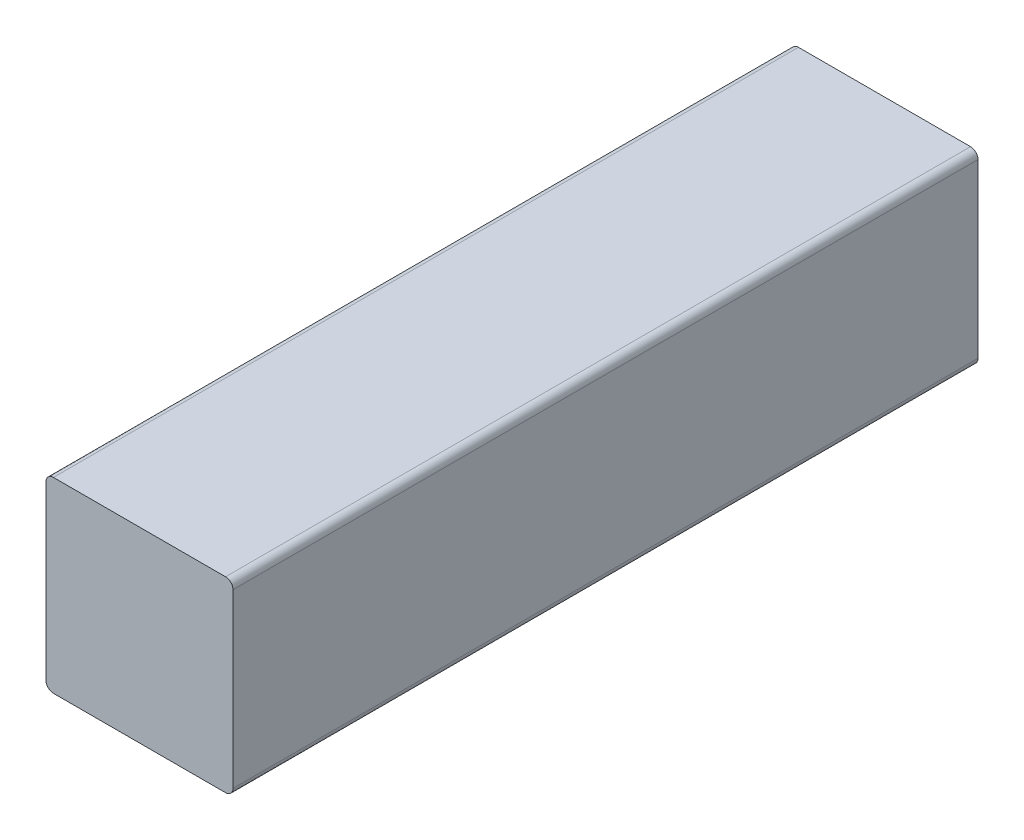
ISO-10303-21;
HEADER;
FILE_DESCRIPTION(('STEP AP214'),'2;1');
FILE_NAME('part.step','',(''),(''),'','','');
FILE_SCHEMA(('AUTOMOTIVE_DESIGN { 1 0 10303 214 1 1 1 1 }'));
ENDSEC;
DATA;
#1=APPLICATION_CONTEXT('core data for automotive mechanical design processes');
#2=APPLICATION_PROTOCOL_DEFINITION('international standard','automotive_design',2000,#1);
#3=PRODUCT_CONTEXT('',#1,'mechanical');
#4=PRODUCT('Part','Part','',(#3));
#5=PRODUCT_RELATED_PRODUCT_CATEGORY('part','',(#4));
#6=PRODUCT_DEFINITION_FORMATION('','',#4);
#7=PRODUCT_DEFINITION_CONTEXT('part definition',#1,'design');
#8=PRODUCT_DEFINITION('design','',#6,#7);
#9=PRODUCT_DEFINITION_SHAPE('','',#8);
#10=(LENGTH_UNIT() NAMED_UNIT(*) SI_UNIT(.MILLI.,.METRE.));
#11=(NAMED_UNIT(*) PLANE_ANGLE_UNIT() SI_UNIT($,.RADIAN.));
#12=(NAMED_UNIT(*) SI_UNIT($,.STERADIAN.) SOLID_ANGLE_UNIT());
#13=UNCERTAINTY_MEASURE_WITH_UNIT(LENGTH_MEASURE(1.E-05),#10,'distance_accuracy_value','');
#14=(GEOMETRIC_REPRESENTATION_CONTEXT(3) GLOBAL_UNCERTAINTY_ASSIGNED_CONTEXT((#13)) GLOBAL_UNIT_ASSIGNED_CONTEXT((#10,
#11,#12)) REPRESENTATION_CONTEXT('',''));
#15=CARTESIAN_POINT('',(0.,0.,0.));
#16=DIRECTION('',(0.,0.,1.));
#17=DIRECTION('',(1.,0.,0.));
#18=AXIS2_PLACEMENT_3D('',#15,#16,#17);
#19=CARTESIAN_POINT('',(0.254,6.1214,25.4));
#20=DIRECTION('',(0.,0.,-1.));
#21=DIRECTION('',(-1.,0.,0.));
#22=AXIS2_PLACEMENT_3D('',#19,#20,#21);
#23=CYLINDRICAL_SURFACE('',#22,0.254);
#24=CARTESIAN_POINT('',(0.254,6.1214,0.));
#25=DIRECTION('',(0.,0.,1.));
#26=DIRECTION('',(1.,0.,0.));
#27=AXIS2_PLACEMENT_3D('',#24,#25,#26);
#28=CIRCLE('',#27,0.254);
#29=CARTESIAN_POINT('',(0.254000000000002,6.3754,0.));
#30=VERTEX_POINT('',#29);
#31=CARTESIAN_POINT('',(0.,6.1214,0.));
#32=VERTEX_POINT('',#31);
#33=EDGE_CURVE('E129',#30,#32,#28,.T.);
#34=ORIENTED_EDGE('',*,*,#33,.T.);
#35=DIRECTION('',(0.,0.,-1.));
#36=VECTOR('',#35,1.);
#37=CARTESIAN_POINT('',(0.,6.1214,25.4));
#38=LINE('',#37,#36);
#39=CARTESIAN_POINT('',(0.,6.1214,25.4));
#40=VERTEX_POINT('',#39);
#41=EDGE_CURVE('E11',#40,#32,#38,.T.);
#42=ORIENTED_EDGE('',*,*,#41,.F.);
#43=CARTESIAN_POINT('',(0.254,6.1214,25.4));
#44=DIRECTION('',(0.,0.,1.));
#45=DIRECTION('',(1.,0.,0.));
#46=AXIS2_PLACEMENT_3D('',#43,#44,#45);
#47=CIRCLE('',#46,0.254);
#48=CARTESIAN_POINT('',(0.254000000000002,6.3754,25.4));
#49=VERTEX_POINT('',#48);
#50=EDGE_CURVE('E143',#49,#40,#47,.T.);
#51=ORIENTED_EDGE('',*,*,#50,.F.);
#52=DIRECTION('',(0.,0.,-1.));
#53=VECTOR('',#52,1.);
#54=CARTESIAN_POINT('',(0.254000000000002,6.3754,25.4));
#55=LINE('',#54,#53);
#56=EDGE_CURVE('E125',#49,#30,#55,.T.);
#57=ORIENTED_EDGE('',*,*,#56,.T.);
#58=EDGE_LOOP('',(#34,#42,#51,#57));
#59=FACE_BOUND('',#58,.T.);
#60=ADVANCED_FACE('F33',(#59),#23,.T.);
#61=CARTESIAN_POINT('',(0.,6.1214,25.4));
#62=DIRECTION('',(1.,0.,0.));
#63=DIRECTION('',(0.,0.,-1.));
#64=AXIS2_PLACEMENT_3D('',#61,#62,#63);
#65=PLANE('',#64);
#66=DIRECTION('',(0.,-1.,0.));
#67=VECTOR('',#66,1.);
#68=CARTESIAN_POINT('',(0.,6.1214,0.));
#69=LINE('',#68,#67);
#70=CARTESIAN_POINT('',(0.,0.254000000000002,0.));
#71=VERTEX_POINT('',#70);
#72=EDGE_CURVE('E132',#32,#71,#69,.T.);
#73=ORIENTED_EDGE('',*,*,#72,.T.);
#74=DIRECTION('',(0.,0.,-1.));
#75=VECTOR('',#74,1.);
#76=CARTESIAN_POINT('',(0.,0.254000000000002,25.4));
#77=LINE('',#76,#75);
#78=CARTESIAN_POINT('',(0.,0.254000000000002,25.4));
#79=VERTEX_POINT('',#78);
#80=EDGE_CURVE('E41',#79,#71,#77,.T.);
#81=ORIENTED_EDGE('',*,*,#80,.F.);
#82=DIRECTION('',(0.,-1.,0.));
#83=VECTOR('',#82,1.);
#84=CARTESIAN_POINT('',(0.,6.1214,25.4));
#85=LINE('',#84,#83);
#86=EDGE_CURVE('E92',#40,#79,#85,.T.);
#87=ORIENTED_EDGE('',*,*,#86,.F.);
#88=ORIENTED_EDGE('',*,*,#41,.T.);
#89=EDGE_LOOP('',(#73,#81,#87,#88));
#90=FACE_BOUND('',#89,.T.);
#91=ADVANCED_FACE('F178',(#90),#65,.F.);
#92=CARTESIAN_POINT('',(0.254,0.254,25.4));
#93=DIRECTION('',(0.,0.,-1.));
#94=DIRECTION('',(-1.,0.,0.));
#95=AXIS2_PLACEMENT_3D('',#92,#93,#94);
#96=CYLINDRICAL_SURFACE('',#95,0.254);
#97=CARTESIAN_POINT('',(0.254,0.254,0.));
#98=DIRECTION('',(0.,0.,1.));
#99=DIRECTION('',(1.,0.,0.));
#100=AXIS2_PLACEMENT_3D('',#97,#98,#99);
#101=CIRCLE('',#100,0.254);
#102=CARTESIAN_POINT('',(0.254000000000002,0.,0.));
#103=VERTEX_POINT('',#102);
#104=EDGE_CURVE('E134',#71,#103,#101,.T.);
#105=ORIENTED_EDGE('',*,*,#104,.T.);
#106=DIRECTION('',(0.,0.,-1.));
#107=VECTOR('',#106,1.);
#108=CARTESIAN_POINT('',(0.254000000000002,0.,25.4));
#109=LINE('',#108,#107);
#110=CARTESIAN_POINT('',(0.254000000000002,0.,25.4));
#111=VERTEX_POINT('',#110);
#112=EDGE_CURVE('E150',#111,#103,#109,.T.);
#113=ORIENTED_EDGE('',*,*,#112,.F.);
#114=CARTESIAN_POINT('',(0.254,0.254,25.4));
#115=DIRECTION('',(0.,0.,1.));
#116=DIRECTION('',(1.,0.,0.));
#117=AXIS2_PLACEMENT_3D('',#114,#115,#116);
#118=CIRCLE('',#117,0.254);
#119=EDGE_CURVE('E158',#79,#111,#118,.T.);
#120=ORIENTED_EDGE('',*,*,#119,.F.);
#121=ORIENTED_EDGE('',*,*,#80,.T.);
#122=EDGE_LOOP('',(#105,#113,#120,#121));
#123=FACE_BOUND('',#122,.T.);
#124=ADVANCED_FACE('F156',(#123),#96,.T.);
#125=CARTESIAN_POINT('',(0.254000000000002,0.,25.4));
#126=DIRECTION('',(0.,1.,0.));
#127=DIRECTION('',(0.,0.,1.));
#128=AXIS2_PLACEMENT_3D('',#125,#126,#127);
#129=PLANE('',#128);
#130=DIRECTION('',(1.,0.,0.));
#131=VECTOR('',#130,1.);
#132=CARTESIAN_POINT('',(0.254000000000002,0.,0.));
#133=LINE('',#132,#131);
#134=CARTESIAN_POINT('',(6.1214,0.,0.));
#135=VERTEX_POINT('',#134);
#136=EDGE_CURVE('E136',#103,#135,#133,.T.);
#137=ORIENTED_EDGE('',*,*,#136,.T.);
#138=DIRECTION('',(0.,0.,-1.));
#139=VECTOR('',#138,1.);
#140=CARTESIAN_POINT('',(6.1214,0.,25.4));
#141=LINE('',#140,#139);
#142=CARTESIAN_POINT('',(6.1214,0.,25.4));
#143=VERTEX_POINT('',#142);
#144=EDGE_CURVE('E147',#143,#135,#141,.T.);
#145=ORIENTED_EDGE('',*,*,#144,.F.);
#146=DIRECTION('',(1.,0.,0.));
#147=VECTOR('',#146,1.);
#148=CARTESIAN_POINT('',(0.254000000000002,0.,25.4));
#149=LINE('',#148,#147);
#150=EDGE_CURVE('E170',#111,#143,#149,.T.);
#151=ORIENTED_EDGE('',*,*,#150,.F.);
#152=ORIENTED_EDGE('',*,*,#112,.T.);
#153=EDGE_LOOP('',(#137,#145,#151,#152));
#154=FACE_BOUND('',#153,.T.);
#155=ADVANCED_FACE('F166',(#154),#129,.F.);
#156=CARTESIAN_POINT('',(6.1214,0.254,25.4));
#157=DIRECTION('',(0.,0.,-1.));
#158=DIRECTION('',(-1.,0.,0.));
#159=AXIS2_PLACEMENT_3D('',#156,#157,#158);
#160=CYLINDRICAL_SURFACE('',#159,0.254);
#161=CARTESIAN_POINT('',(6.1214,0.254,0.));
#162=DIRECTION('',(0.,0.,1.));
#163=DIRECTION('',(1.,0.,0.));
#164=AXIS2_PLACEMENT_3D('',#161,#162,#163);
#165=CIRCLE('',#164,0.254);
#166=CARTESIAN_POINT('',(6.3754,0.254000000000002,0.));
#167=VERTEX_POINT('',#166);
#168=EDGE_CURVE('E138',#135,#167,#165,.T.);
#169=ORIENTED_EDGE('',*,*,#168,.T.);
#170=DIRECTION('',(0.,0.,-1.));
#171=VECTOR('',#170,1.);
#172=CARTESIAN_POINT('',(6.3754,0.254000000000002,25.4));
#173=LINE('',#172,#171);
#174=CARTESIAN_POINT('',(6.3754,0.254000000000002,25.4));
#175=VERTEX_POINT('',#174);
#176=EDGE_CURVE('E120',#175,#167,#173,.T.);
#177=ORIENTED_EDGE('',*,*,#176,.F.);
#178=CARTESIAN_POINT('',(6.1214,0.254,25.4));
#179=DIRECTION('',(0.,0.,1.));
#180=DIRECTION('',(1.,0.,0.));
#181=AXIS2_PLACEMENT_3D('',#178,#179,#180);
#182=CIRCLE('',#181,0.254);
#183=EDGE_CURVE('E111',#143,#175,#182,.T.);
#184=ORIENTED_EDGE('',*,*,#183,.F.);
#185=ORIENTED_EDGE('',*,*,#144,.T.);
#186=EDGE_LOOP('',(#169,#177,#184,#185));
#187=FACE_BOUND('',#186,.T.);
#188=ADVANCED_FACE('F169',(#187),#160,.T.);
#189=CARTESIAN_POINT('',(6.3754,0.254000000000002,25.4));
#190=DIRECTION('',(-1.,0.,0.));
#191=DIRECTION('',(0.,0.,1.));
#192=AXIS2_PLACEMENT_3D('',#189,#190,#191);
#193=PLANE('',#192);
#194=DIRECTION('',(0.,1.,0.));
#195=VECTOR('',#194,1.);
#196=CARTESIAN_POINT('',(6.3754,0.254000000000002,0.));
#197=LINE('',#196,#195);
#198=CARTESIAN_POINT('',(6.3754,6.1214,0.));
#199=VERTEX_POINT('',#198);
#200=EDGE_CURVE('E119',#167,#199,#197,.T.);
#201=ORIENTED_EDGE('',*,*,#200,.T.);
#202=DIRECTION('',(0.,0.,-1.));
#203=VECTOR('',#202,1.);
#204=CARTESIAN_POINT('',(6.3754,6.1214,25.4));
#205=LINE('',#204,#203);
#206=CARTESIAN_POINT('',(6.3754,6.1214,25.4));
#207=VERTEX_POINT('',#206);
#208=EDGE_CURVE('E116',#207,#199,#205,.T.);
#209=ORIENTED_EDGE('',*,*,#208,.F.);
#210=DIRECTION('',(0.,1.,0.));
#211=VECTOR('',#210,1.);
#212=CARTESIAN_POINT('',(6.3754,0.254000000000002,25.4));
#213=LINE('',#212,#211);
#214=EDGE_CURVE('E105',#175,#207,#213,.T.);
#215=ORIENTED_EDGE('',*,*,#214,.F.);
#216=ORIENTED_EDGE('',*,*,#176,.T.);
#217=EDGE_LOOP('',(#201,#209,#215,#216));
#218=FACE_BOUND('',#217,.T.);
#219=ADVANCED_FACE('F117',(#218),#193,.F.);
#220=CARTESIAN_POINT('',(6.1214,6.1214,25.4));
#221=DIRECTION('',(0.,0.,-1.));
#222=DIRECTION('',(-1.,0.,0.));
#223=AXIS2_PLACEMENT_3D('',#220,#221,#222);
#224=CYLINDRICAL_SURFACE('',#223,0.254);
#225=CARTESIAN_POINT('',(6.1214,6.1214,0.));
#226=DIRECTION('',(0.,0.,1.));
#227=DIRECTION('',(1.,0.,0.));
#228=AXIS2_PLACEMENT_3D('',#225,#226,#227);
#229=CIRCLE('',#228,0.254);
#230=CARTESIAN_POINT('',(6.1214,6.3754,0.));
#231=VERTEX_POINT('',#230);
#232=EDGE_CURVE('E78',#199,#231,#229,.T.);
#233=ORIENTED_EDGE('',*,*,#232,.T.);
#234=DIRECTION('',(0.,0.,-1.));
#235=VECTOR('',#234,1.);
#236=CARTESIAN_POINT('',(6.1214,6.3754,25.4));
#237=LINE('',#236,#235);
#238=CARTESIAN_POINT('',(6.1214,6.3754,25.4));
#239=VERTEX_POINT('',#238);
#240=EDGE_CURVE('E121',#239,#231,#237,.T.);
#241=ORIENTED_EDGE('',*,*,#240,.F.);
#242=CARTESIAN_POINT('',(6.1214,6.1214,25.4));
#243=DIRECTION('',(0.,0.,1.));
#244=DIRECTION('',(1.,0.,0.));
#245=AXIS2_PLACEMENT_3D('',#242,#243,#244);
#246=CIRCLE('',#245,0.254);
#247=EDGE_CURVE('E109',#207,#239,#246,.T.);
#248=ORIENTED_EDGE('',*,*,#247,.F.);
#249=ORIENTED_EDGE('',*,*,#208,.T.);
#250=EDGE_LOOP('',(#233,#241,#248,#249));
#251=FACE_BOUND('',#250,.T.);
#252=ADVANCED_FACE('F123',(#251),#224,.T.);
#253=CARTESIAN_POINT('',(6.1214,6.3754,25.4));
#254=DIRECTION('',(0.,-1.,0.));
#255=DIRECTION('',(0.,0.,-1.));
#256=AXIS2_PLACEMENT_3D('',#253,#254,#255);
#257=PLANE('',#256);
#258=DIRECTION('',(-1.,0.,0.));
#259=VECTOR('',#258,1.);
#260=CARTESIAN_POINT('',(6.1214,6.3754,0.));
#261=LINE('',#260,#259);
#262=EDGE_CURVE('E84',#231,#30,#261,.T.);
#263=ORIENTED_EDGE('',*,*,#262,.T.);
#264=ORIENTED_EDGE('',*,*,#56,.F.);
#265=DIRECTION('',(-1.,0.,0.));
#266=VECTOR('',#265,1.);
#267=CARTESIAN_POINT('',(6.1214,6.3754,25.4));
#268=LINE('',#267,#266);
#269=EDGE_CURVE('E49',#239,#49,#268,.T.);
#270=ORIENTED_EDGE('',*,*,#269,.F.);
#271=ORIENTED_EDGE('',*,*,#240,.T.);
#272=EDGE_LOOP('',(#263,#264,#270,#271));
#273=FACE_BOUND('',#272,.T.);
#274=ADVANCED_FACE('F194',(#273),#257,.F.);
#275=CARTESIAN_POINT('',(0.254,6.1214,25.4));
#276=DIRECTION('',(0.,0.,1.));
#277=DIRECTION('',(1.,0.,0.));
#278=AXIS2_PLACEMENT_3D('',#275,#276,#277);
#279=PLANE('',#278);
#280=ORIENTED_EDGE('',*,*,#50,.T.);
#281=ORIENTED_EDGE('',*,*,#86,.T.);
#282=ORIENTED_EDGE('',*,*,#119,.T.);
#283=ORIENTED_EDGE('',*,*,#150,.T.);
#284=ORIENTED_EDGE('',*,*,#183,.T.);
#285=ORIENTED_EDGE('',*,*,#214,.T.);
#286=ORIENTED_EDGE('',*,*,#247,.T.);
#287=ORIENTED_EDGE('',*,*,#269,.T.);
#288=EDGE_LOOP('',(#280,#281,#282,#283,#284,#285,#286,#287));
#289=FACE_BOUND('',#288,.T.);
#290=ADVANCED_FACE('F107',(#289),#279,.T.);
#291=CARTESIAN_POINT('',(0.254,6.1214,0.));
#292=DIRECTION('',(0.,0.,1.));
#293=DIRECTION('',(1.,0.,0.));
#294=AXIS2_PLACEMENT_3D('',#291,#292,#293);
#295=PLANE('',#294);
#296=ORIENTED_EDGE('',*,*,#33,.F.);
#297=ORIENTED_EDGE('',*,*,#262,.F.);
#298=ORIENTED_EDGE('',*,*,#232,.F.);
#299=ORIENTED_EDGE('',*,*,#200,.F.);
#300=ORIENTED_EDGE('',*,*,#168,.F.);
#301=ORIENTED_EDGE('',*,*,#136,.F.);
#302=ORIENTED_EDGE('',*,*,#104,.F.);
#303=ORIENTED_EDGE('',*,*,#72,.F.);
#304=EDGE_LOOP('',(#296,#297,#298,#299,#300,#301,#302,#303));
#305=FACE_BOUND('',#304,.T.);
#306=ADVANCED_FACE('F162',(#305),#295,.F.);
#307=CLOSED_SHELL('',(#60,#91,#124,#155,#188,#219,#252,#274,#290,#306));
#308=MANIFOLD_SOLID_BREP('B2',#307);
#309=ADVANCED_BREP_SHAPE_REPRESENTATION('',(#18,#308),#14);
#310=SHAPE_DEFINITION_REPRESENTATION(#9,#309);
ENDSEC;
END-ISO-10303-21;
